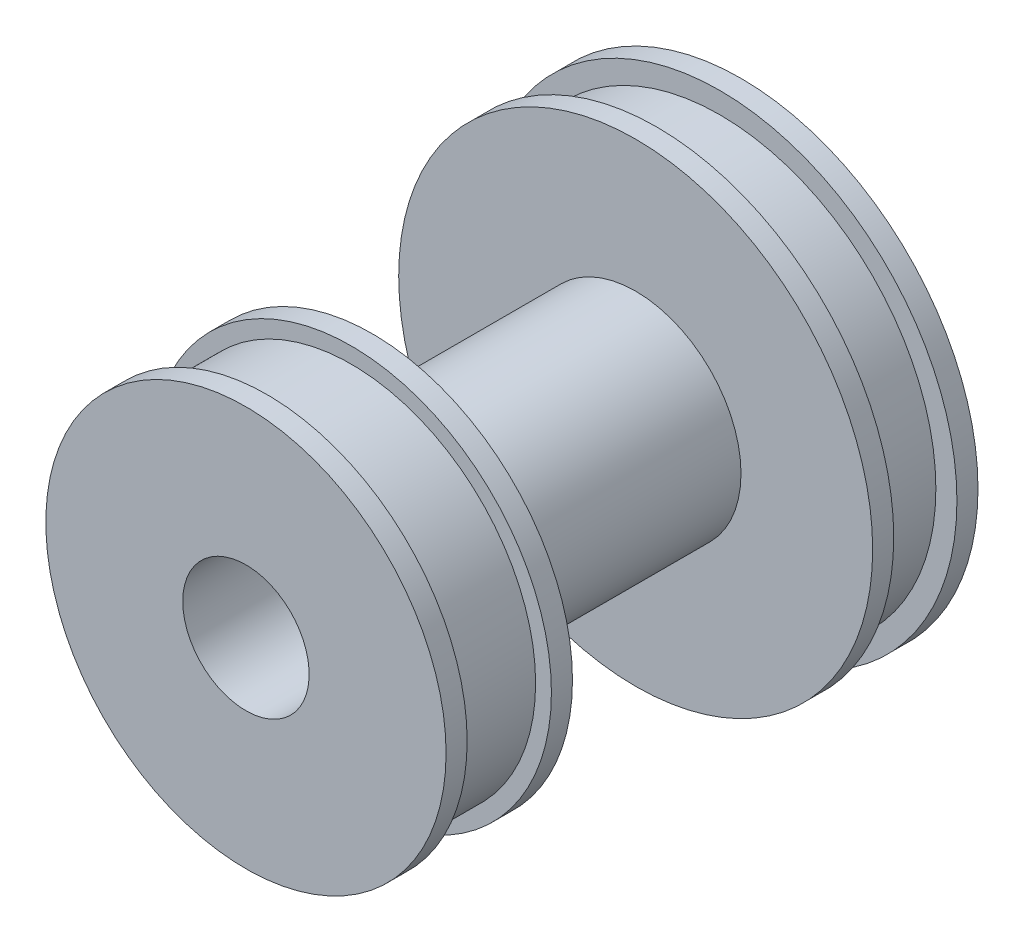
ISO-10303-21;
HEADER;
FILE_DESCRIPTION(('STEP AP214'),'2;1');
FILE_NAME('part.step','',(''),(''),'','','');
FILE_SCHEMA(('AUTOMOTIVE_DESIGN { 1 0 10303 214 1 1 1 1 }'));
ENDSEC;
DATA;
#1=APPLICATION_CONTEXT('core data for automotive mechanical design processes');
#2=APPLICATION_PROTOCOL_DEFINITION('international standard','automotive_design',2000,#1);
#3=PRODUCT_CONTEXT('',#1,'mechanical');
#4=PRODUCT('Part','Part','',(#3));
#5=PRODUCT_RELATED_PRODUCT_CATEGORY('part','',(#4));
#6=PRODUCT_DEFINITION_FORMATION('','',#4);
#7=PRODUCT_DEFINITION_CONTEXT('part definition',#1,'design');
#8=PRODUCT_DEFINITION('design','',#6,#7);
#9=PRODUCT_DEFINITION_SHAPE('','',#8);
#10=(LENGTH_UNIT() NAMED_UNIT(*) SI_UNIT(.MILLI.,.METRE.));
#11=(NAMED_UNIT(*) PLANE_ANGLE_UNIT() SI_UNIT($,.RADIAN.));
#12=(NAMED_UNIT(*) SI_UNIT($,.STERADIAN.) SOLID_ANGLE_UNIT());
#13=UNCERTAINTY_MEASURE_WITH_UNIT(LENGTH_MEASURE(1.E-05),#10,'distance_accuracy_value','');
#14=(GEOMETRIC_REPRESENTATION_CONTEXT(3) GLOBAL_UNCERTAINTY_ASSIGNED_CONTEXT((#13)) GLOBAL_UNIT_ASSIGNED_CONTEXT((#10,
#11,#12)) REPRESENTATION_CONTEXT('',''));
#15=CARTESIAN_POINT('',(0.,0.,0.));
#16=DIRECTION('',(0.,0.,1.));
#17=DIRECTION('',(1.,0.,0.));
#18=AXIS2_PLACEMENT_3D('',#15,#16,#17);
#19=CARTESIAN_POINT('',(0.,0.,2.));
#20=DIRECTION('',(0.,0.,-1.));
#21=DIRECTION('',(-1.,0.,0.));
#22=AXIS2_PLACEMENT_3D('',#19,#20,#21);
#23=CYLINDRICAL_SURFACE('',#22,22.5);
#24=CARTESIAN_POINT('',(0.,0.,2.));
#25=DIRECTION('',(0.,0.,1.));
#26=DIRECTION('',(1.,0.,0.));
#27=AXIS2_PLACEMENT_3D('',#24,#25,#26);
#28=CIRCLE('',#27,22.5);
#29=CARTESIAN_POINT('',(22.5,0.,2.));
#30=VERTEX_POINT('',#29);
#31=EDGE_CURVE('E40',#30,#30,#28,.T.);
#32=ORIENTED_EDGE('',*,*,#31,.F.);
#33=EDGE_LOOP('',(#32));
#34=FACE_BOUND('',#33,.T.);
#35=CARTESIAN_POINT('',(0.,0.,0.));
#36=DIRECTION('',(0.,0.,1.));
#37=DIRECTION('',(1.,0.,0.));
#38=AXIS2_PLACEMENT_3D('',#35,#36,#37);
#39=CIRCLE('',#38,22.5);
#40=CARTESIAN_POINT('',(22.5,0.,0.));
#41=VERTEX_POINT('',#40);
#42=EDGE_CURVE('E36',#41,#41,#39,.T.);
#43=ORIENTED_EDGE('',*,*,#42,.T.);
#44=EDGE_LOOP('',(#43));
#45=FACE_BOUND('',#44,.T.);
#46=ADVANCED_FACE('F33',(#34,#45),#23,.T.);
#47=CARTESIAN_POINT('',(0.,0.,2.));
#48=DIRECTION('',(0.,0.,1.));
#49=DIRECTION('',(1.,0.,0.));
#50=AXIS2_PLACEMENT_3D('',#47,#48,#49);
#51=PLANE('',#50);
#52=CARTESIAN_POINT('',(0.,0.,2.));
#53=DIRECTION('',(0.,0.,1.));
#54=DIRECTION('',(1.,0.,0.));
#55=AXIS2_PLACEMENT_3D('',#52,#53,#54);
#56=CIRCLE('',#55,20.5);
#57=CARTESIAN_POINT('',(20.5,0.,2.));
#58=VERTEX_POINT('',#57);
#59=EDGE_CURVE('E70',#58,#58,#56,.F.);
#60=ORIENTED_EDGE('',*,*,#59,.T.);
#61=EDGE_LOOP('',(#60));
#62=FACE_BOUND('',#61,.T.);
#63=ORIENTED_EDGE('',*,*,#31,.T.);
#64=EDGE_LOOP('',(#63));
#65=FACE_BOUND('',#64,.T.);
#66=ADVANCED_FACE('F81',(#62,#65),#51,.T.);
#67=CARTESIAN_POINT('',(0.,0.,0.));
#68=DIRECTION('',(0.,0.,1.));
#69=DIRECTION('',(1.,0.,0.));
#70=AXIS2_PLACEMENT_3D('',#67,#68,#69);
#71=PLANE('',#70);
#72=CARTESIAN_POINT('',(0.,0.,0.));
#73=DIRECTION('',(0.,0.,-1.));
#74=DIRECTION('',(-1.,0.,0.));
#75=AXIS2_PLACEMENT_3D('',#72,#73,#74);
#76=CIRCLE('',#75,5.99999999999999);
#77=CARTESIAN_POINT('',(-5.99999999999999,0.,0.));
#78=VERTEX_POINT('',#77);
#79=EDGE_CURVE('E240',#78,#78,#76,.T.);
#80=ORIENTED_EDGE('',*,*,#79,.F.);
#81=EDGE_LOOP('',(#80));
#82=FACE_BOUND('',#81,.T.);
#83=ORIENTED_EDGE('',*,*,#42,.F.);
#84=EDGE_LOOP('',(#83));
#85=FACE_BOUND('',#84,.T.);
#86=ADVANCED_FACE('F78',(#82,#85),#71,.F.);
#87=CARTESIAN_POINT('',(0.,0.,8.));
#88=DIRECTION('',(0.,0.,-1.));
#89=DIRECTION('',(-1.,0.,0.));
#90=AXIS2_PLACEMENT_3D('',#87,#88,#89);
#91=CYLINDRICAL_SURFACE('',#90,20.5);
#92=ORIENTED_EDGE('',*,*,#59,.F.);
#93=EDGE_LOOP('',(#92));
#94=FACE_BOUND('',#93,.T.);
#95=CARTESIAN_POINT('',(0.,0.,8.));
#96=DIRECTION('',(0.,0.,1.));
#97=DIRECTION('',(1.,0.,0.));
#98=AXIS2_PLACEMENT_3D('',#95,#96,#97);
#99=CIRCLE('',#98,20.5);
#100=CARTESIAN_POINT('',(20.5,0.,8.));
#101=VERTEX_POINT('',#100);
#102=EDGE_CURVE('E65',#101,#101,#99,.T.);
#103=ORIENTED_EDGE('',*,*,#102,.F.);
#104=EDGE_LOOP('',(#103));
#105=FACE_BOUND('',#104,.T.);
#106=ADVANCED_FACE('F80',(#94,#105),#91,.T.);
#107=CARTESIAN_POINT('',(0.,0.,10.));
#108=DIRECTION('',(0.,0.,-1.));
#109=DIRECTION('',(-1.,0.,0.));
#110=AXIS2_PLACEMENT_3D('',#107,#108,#109);
#111=CYLINDRICAL_SURFACE('',#110,22.5);
#112=CARTESIAN_POINT('',(0.,0.,10.));
#113=DIRECTION('',(0.,0.,1.));
#114=DIRECTION('',(1.,0.,0.));
#115=AXIS2_PLACEMENT_3D('',#112,#113,#114);
#116=CIRCLE('',#115,22.5);
#117=CARTESIAN_POINT('',(22.5,0.,10.));
#118=VERTEX_POINT('',#117);
#119=EDGE_CURVE('E62',#118,#118,#116,.T.);
#120=ORIENTED_EDGE('',*,*,#119,.F.);
#121=EDGE_LOOP('',(#120));
#122=FACE_BOUND('',#121,.T.);
#123=CARTESIAN_POINT('',(0.,0.,8.));
#124=DIRECTION('',(0.,0.,1.));
#125=DIRECTION('',(1.,0.,0.));
#126=AXIS2_PLACEMENT_3D('',#123,#124,#125);
#127=CIRCLE('',#126,22.5);
#128=CARTESIAN_POINT('',(22.5,0.,8.));
#129=VERTEX_POINT('',#128);
#130=EDGE_CURVE('E59',#129,#129,#127,.T.);
#131=ORIENTED_EDGE('',*,*,#130,.T.);
#132=EDGE_LOOP('',(#131));
#133=FACE_BOUND('',#132,.T.);
#134=ADVANCED_FACE('F87',(#122,#133),#111,.T.);
#135=CARTESIAN_POINT('',(0.,0.,10.));
#136=DIRECTION('',(0.,0.,1.));
#137=DIRECTION('',(1.,0.,0.));
#138=AXIS2_PLACEMENT_3D('',#135,#136,#137);
#139=PLANE('',#138);
#140=CARTESIAN_POINT('',(0.,0.,10.));
#141=DIRECTION('',(0.,0.,1.));
#142=DIRECTION('',(1.,0.,0.));
#143=AXIS2_PLACEMENT_3D('',#140,#141,#142);
#144=CIRCLE('',#143,10.);
#145=CARTESIAN_POINT('',(10.,0.,10.));
#146=VERTEX_POINT('',#145);
#147=EDGE_CURVE('E52',#146,#146,#144,.T.);
#148=ORIENTED_EDGE('',*,*,#147,.F.);
#149=EDGE_LOOP('',(#148));
#150=FACE_BOUND('',#149,.T.);
#151=ORIENTED_EDGE('',*,*,#119,.T.);
#152=EDGE_LOOP('',(#151));
#153=FACE_BOUND('',#152,.T.);
#154=ADVANCED_FACE('F118',(#150,#153),#139,.T.);
#155=CARTESIAN_POINT('',(0.,0.,8.));
#156=DIRECTION('',(0.,0.,1.));
#157=DIRECTION('',(1.,0.,0.));
#158=AXIS2_PLACEMENT_3D('',#155,#156,#157);
#159=PLANE('',#158);
#160=ORIENTED_EDGE('',*,*,#102,.T.);
#161=EDGE_LOOP('',(#160));
#162=FACE_BOUND('',#161,.T.);
#163=ORIENTED_EDGE('',*,*,#130,.F.);
#164=EDGE_LOOP('',(#163));
#165=FACE_BOUND('',#164,.T.);
#166=ADVANCED_FACE('F126',(#162,#165),#159,.F.);
#167=CARTESIAN_POINT('',(0.,0.,35.));
#168=DIRECTION('',(0.,0.,-1.));
#169=DIRECTION('',(-1.,0.,0.));
#170=AXIS2_PLACEMENT_3D('',#167,#168,#169);
#171=CYLINDRICAL_SURFACE('',#170,10.);
#172=CARTESIAN_POINT('',(0.,0.,35.));
#173=DIRECTION('',(0.,0.,1.));
#174=DIRECTION('',(1.,0.,0.));
#175=AXIS2_PLACEMENT_3D('',#172,#173,#174);
#176=CIRCLE('',#175,10.);
#177=CARTESIAN_POINT('',(10.,0.,35.));
#178=VERTEX_POINT('',#177);
#179=EDGE_CURVE('E56',#178,#178,#176,.T.);
#180=ORIENTED_EDGE('',*,*,#179,.F.);
#181=EDGE_LOOP('',(#180));
#182=FACE_BOUND('',#181,.T.);
#183=ORIENTED_EDGE('',*,*,#147,.T.);
#184=EDGE_LOOP('',(#183));
#185=FACE_BOUND('',#184,.T.);
#186=ADVANCED_FACE('F131',(#182,#185),#171,.T.);
#187=CARTESIAN_POINT('',(0.,0.,37.));
#188=DIRECTION('',(0.,0.,-1.));
#189=DIRECTION('',(-1.,0.,0.));
#190=AXIS2_PLACEMENT_3D('',#187,#188,#189);
#191=CYLINDRICAL_SURFACE('',#190,19.);
#192=CARTESIAN_POINT('',(0.,0.,37.));
#193=DIRECTION('',(0.,0.,1.));
#194=DIRECTION('',(1.,0.,0.));
#195=AXIS2_PLACEMENT_3D('',#192,#193,#194);
#196=CIRCLE('',#195,19.);
#197=CARTESIAN_POINT('',(19.,0.,37.));
#198=VERTEX_POINT('',#197);
#199=EDGE_CURVE('E49',#198,#198,#196,.T.);
#200=ORIENTED_EDGE('',*,*,#199,.F.);
#201=EDGE_LOOP('',(#200));
#202=FACE_BOUND('',#201,.T.);
#203=CARTESIAN_POINT('',(0.,0.,35.));
#204=DIRECTION('',(0.,0.,1.));
#205=DIRECTION('',(1.,0.,0.));
#206=AXIS2_PLACEMENT_3D('',#203,#204,#205);
#207=CIRCLE('',#206,19.);
#208=CARTESIAN_POINT('',(19.,0.,35.));
#209=VERTEX_POINT('',#208);
#210=EDGE_CURVE('E53',#209,#209,#207,.T.);
#211=ORIENTED_EDGE('',*,*,#210,.T.);
#212=EDGE_LOOP('',(#211));
#213=FACE_BOUND('',#212,.T.);
#214=ADVANCED_FACE('F148',(#202,#213),#191,.T.);
#215=CARTESIAN_POINT('',(0.,0.,37.));
#216=DIRECTION('',(0.,0.,1.));
#217=DIRECTION('',(1.,0.,0.));
#218=AXIS2_PLACEMENT_3D('',#215,#216,#217);
#219=PLANE('',#218);
#220=CARTESIAN_POINT('',(0.,0.,37.));
#221=DIRECTION('',(0.,0.,1.));
#222=DIRECTION('',(1.,0.,0.));
#223=AXIS2_PLACEMENT_3D('',#220,#221,#222);
#224=CIRCLE('',#223,17.5);
#225=CARTESIAN_POINT('',(17.5,0.,37.));
#226=VERTEX_POINT('',#225);
#227=EDGE_CURVE('E10',#226,#226,#224,.T.);
#228=ORIENTED_EDGE('',*,*,#227,.F.);
#229=EDGE_LOOP('',(#228));
#230=FACE_BOUND('',#229,.T.);
#231=ORIENTED_EDGE('',*,*,#199,.T.);
#232=EDGE_LOOP('',(#231));
#233=FACE_BOUND('',#232,.T.);
#234=ADVANCED_FACE('F158',(#230,#233),#219,.T.);
#235=CARTESIAN_POINT('',(0.,0.,35.));
#236=DIRECTION('',(0.,0.,1.));
#237=DIRECTION('',(1.,0.,0.));
#238=AXIS2_PLACEMENT_3D('',#235,#236,#237);
#239=PLANE('',#238);
#240=ORIENTED_EDGE('',*,*,#179,.T.);
#241=EDGE_LOOP('',(#240));
#242=FACE_BOUND('',#241,.T.);
#243=ORIENTED_EDGE('',*,*,#210,.F.);
#244=EDGE_LOOP('',(#243));
#245=FACE_BOUND('',#244,.T.);
#246=ADVANCED_FACE('F166',(#242,#245),#239,.F.);
#247=CARTESIAN_POINT('',(0.,0.,45.));
#248=DIRECTION('',(0.,0.,-1.));
#249=DIRECTION('',(-1.,0.,0.));
#250=AXIS2_PLACEMENT_3D('',#247,#248,#249);
#251=CYLINDRICAL_SURFACE('',#250,17.5);
#252=CARTESIAN_POINT('',(0.,0.,45.));
#253=DIRECTION('',(0.,0.,1.));
#254=DIRECTION('',(1.,0.,0.));
#255=AXIS2_PLACEMENT_3D('',#252,#253,#254);
#256=CIRCLE('',#255,17.5);
#257=CARTESIAN_POINT('',(17.5,0.,45.));
#258=VERTEX_POINT('',#257);
#259=EDGE_CURVE('E47',#258,#258,#256,.T.);
#260=ORIENTED_EDGE('',*,*,#259,.F.);
#261=EDGE_LOOP('',(#260));
#262=FACE_BOUND('',#261,.T.);
#263=ORIENTED_EDGE('',*,*,#227,.T.);
#264=EDGE_LOOP('',(#263));
#265=FACE_BOUND('',#264,.T.);
#266=ADVANCED_FACE('F171',(#262,#265),#251,.T.);
#267=CARTESIAN_POINT('',(0.,0.,47.));
#268=DIRECTION('',(0.,0.,-1.));
#269=DIRECTION('',(-1.,0.,0.));
#270=AXIS2_PLACEMENT_3D('',#267,#268,#269);
#271=CYLINDRICAL_SURFACE('',#270,19.);
#272=CARTESIAN_POINT('',(0.,0.,47.));
#273=DIRECTION('',(0.,0.,1.));
#274=DIRECTION('',(1.,0.,0.));
#275=AXIS2_PLACEMENT_3D('',#272,#273,#274);
#276=CIRCLE('',#275,19.);
#277=CARTESIAN_POINT('',(19.,0.,47.));
#278=VERTEX_POINT('',#277);
#279=EDGE_CURVE('E245',#278,#278,#276,.T.);
#280=ORIENTED_EDGE('',*,*,#279,.F.);
#281=EDGE_LOOP('',(#280));
#282=FACE_BOUND('',#281,.T.);
#283=CARTESIAN_POINT('',(0.,0.,45.));
#284=DIRECTION('',(0.,0.,1.));
#285=DIRECTION('',(1.,0.,0.));
#286=AXIS2_PLACEMENT_3D('',#283,#284,#285);
#287=CIRCLE('',#286,19.);
#288=CARTESIAN_POINT('',(19.,0.,45.));
#289=VERTEX_POINT('',#288);
#290=EDGE_CURVE('E242',#289,#289,#287,.T.);
#291=ORIENTED_EDGE('',*,*,#290,.T.);
#292=EDGE_LOOP('',(#291));
#293=FACE_BOUND('',#292,.T.);
#294=ADVANCED_FACE('F188',(#282,#293),#271,.T.);
#295=CARTESIAN_POINT('',(0.,0.,47.));
#296=DIRECTION('',(0.,0.,1.));
#297=DIRECTION('',(1.,0.,0.));
#298=AXIS2_PLACEMENT_3D('',#295,#296,#297);
#299=PLANE('',#298);
#300=CARTESIAN_POINT('',(0.,0.,47.));
#301=DIRECTION('',(0.,0.,-1.));
#302=DIRECTION('',(-1.,0.,0.));
#303=AXIS2_PLACEMENT_3D('',#300,#301,#302);
#304=CIRCLE('',#303,5.99999999999999);
#305=CARTESIAN_POINT('',(-5.99999999999999,0.,47.));
#306=VERTEX_POINT('',#305);
#307=EDGE_CURVE('E238',#306,#306,#304,.T.);
#308=ORIENTED_EDGE('',*,*,#307,.T.);
#309=EDGE_LOOP('',(#308));
#310=FACE_BOUND('',#309,.T.);
#311=ORIENTED_EDGE('',*,*,#279,.T.);
#312=EDGE_LOOP('',(#311));
#313=FACE_BOUND('',#312,.T.);
#314=ADVANCED_FACE('F198',(#310,#313),#299,.T.);
#315=CARTESIAN_POINT('',(0.,0.,45.));
#316=DIRECTION('',(0.,0.,1.));
#317=DIRECTION('',(1.,0.,0.));
#318=AXIS2_PLACEMENT_3D('',#315,#316,#317);
#319=PLANE('',#318);
#320=ORIENTED_EDGE('',*,*,#259,.T.);
#321=EDGE_LOOP('',(#320));
#322=FACE_BOUND('',#321,.T.);
#323=ORIENTED_EDGE('',*,*,#290,.F.);
#324=EDGE_LOOP('',(#323));
#325=FACE_BOUND('',#324,.T.);
#326=ADVANCED_FACE('F206',(#322,#325),#319,.F.);
#327=CARTESIAN_POINT('',(0.,0.,0.));
#328=DIRECTION('',(0.,0.,-1.));
#329=DIRECTION('',(-1.,0.,0.));
#330=AXIS2_PLACEMENT_3D('',#327,#328,#329);
#331=CYLINDRICAL_SURFACE('',#330,5.99999999999999);
#332=ORIENTED_EDGE('',*,*,#307,.F.);
#333=EDGE_LOOP('',(#332));
#334=FACE_BOUND('',#333,.T.);
#335=ORIENTED_EDGE('',*,*,#79,.T.);
#336=EDGE_LOOP('',(#335));
#337=FACE_BOUND('',#336,.T.);
#338=ADVANCED_FACE('F210',(#334,#337),#331,.F.);
#339=CLOSED_SHELL('',(#46,#66,#86,#106,#134,#154,#166,#186,#214,#234,#246,#266,#294,#314,#326,#338));
#340=MANIFOLD_SOLID_BREP('B2',#339);
#341=ADVANCED_BREP_SHAPE_REPRESENTATION('',(#18,#340),#14);
#342=SHAPE_DEFINITION_REPRESENTATION(#9,#341);
ENDSEC;
END-ISO-10303-21;
